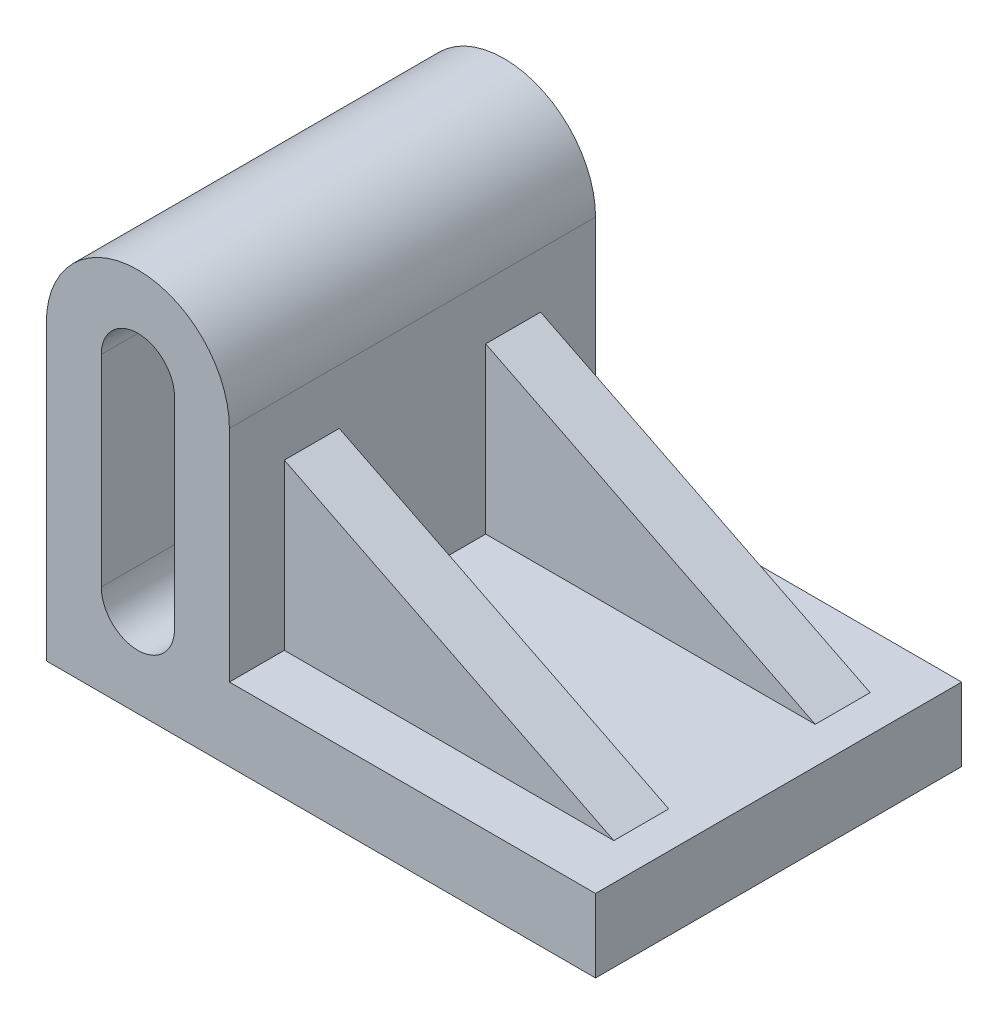
ISO-10303-21;
HEADER;
FILE_DESCRIPTION(('STEP AP214'),'2;1');
FILE_NAME('part.step','',(''),(''),'','','');
FILE_SCHEMA(('AUTOMOTIVE_DESIGN { 1 0 10303 214 1 1 1 1 }'));
ENDSEC;
DATA;
#1=APPLICATION_CONTEXT('core data for automotive mechanical design processes');
#2=APPLICATION_PROTOCOL_DEFINITION('international standard','automotive_design',2000,#1);
#3=PRODUCT_CONTEXT('',#1,'mechanical');
#4=PRODUCT('Part','Part','',(#3));
#5=PRODUCT_RELATED_PRODUCT_CATEGORY('part','',(#4));
#6=PRODUCT_DEFINITION_FORMATION('','',#4);
#7=PRODUCT_DEFINITION_CONTEXT('part definition',#1,'design');
#8=PRODUCT_DEFINITION('design','',#6,#7);
#9=PRODUCT_DEFINITION_SHAPE('','',#8);
#10=(LENGTH_UNIT() NAMED_UNIT(*) SI_UNIT(.MILLI.,.METRE.));
#11=(NAMED_UNIT(*) PLANE_ANGLE_UNIT() SI_UNIT($,.RADIAN.));
#12=(NAMED_UNIT(*) SI_UNIT($,.STERADIAN.) SOLID_ANGLE_UNIT());
#13=UNCERTAINTY_MEASURE_WITH_UNIT(LENGTH_MEASURE(1.E-05),#10,'distance_accuracy_value','');
#14=(GEOMETRIC_REPRESENTATION_CONTEXT(3) GLOBAL_UNCERTAINTY_ASSIGNED_CONTEXT((#13)) GLOBAL_UNIT_ASSIGNED_CONTEXT((#10,
#11,#12)) REPRESENTATION_CONTEXT('',''));
#15=CARTESIAN_POINT('',(0.,0.,0.));
#16=DIRECTION('',(0.,0.,1.));
#17=DIRECTION('',(1.,0.,0.));
#18=AXIS2_PLACEMENT_3D('',#15,#16,#17);
#19=CARTESIAN_POINT('',(140.,20.,-35.));
#20=DIRECTION('',(0.447213595499958,0.894427190999916,0.));
#21=DIRECTION('',(-0.894427190999916,0.447213595499958,0.));
#22=AXIS2_PLACEMENT_3D('',#19,#20,#21);
#23=PLANE('',#22);
#24=DIRECTION('',(0.,0.,1.));
#25=VECTOR('',#24,1.);
#26=CARTESIAN_POINT('',(50.,65.,-35.));
#27=LINE('',#26,#25);
#28=CARTESIAN_POINT('',(50.,65.,-35.));
#29=VERTEX_POINT('',#28);
#30=CARTESIAN_POINT('',(50.,65.,-20.));
#31=VERTEX_POINT('',#30);
#32=EDGE_CURVE('E71',#29,#31,#27,.T.);
#33=ORIENTED_EDGE('',*,*,#32,.T.);
#34=DIRECTION('',(-0.894427190999916,0.447213595499958,0.));
#35=VECTOR('',#34,1.);
#36=CARTESIAN_POINT('',(140.,20.,-20.));
#37=LINE('',#36,#35);
#38=CARTESIAN_POINT('',(140.,20.,-20.));
#39=VERTEX_POINT('',#38);
#40=EDGE_CURVE('E164',#39,#31,#37,.T.);
#41=ORIENTED_EDGE('',*,*,#40,.F.);
#42=DIRECTION('',(0.,0.,1.));
#43=VECTOR('',#42,1.);
#44=CARTESIAN_POINT('',(140.,20.,-35.));
#45=LINE('',#44,#43);
#46=CARTESIAN_POINT('',(140.,20.,-35.));
#47=VERTEX_POINT('',#46);
#48=EDGE_CURVE('E181',#47,#39,#45,.T.);
#49=ORIENTED_EDGE('',*,*,#48,.F.);
#50=DIRECTION('',(-0.894427190999916,0.447213595499958,0.));
#51=VECTOR('',#50,1.);
#52=CARTESIAN_POINT('',(140.,20.,-35.));
#53=LINE('',#52,#51);
#54=EDGE_CURVE('E174',#47,#29,#53,.T.);
#55=ORIENTED_EDGE('',*,*,#54,.T.);
#56=EDGE_LOOP('',(#33,#41,#49,#55));
#57=FACE_BOUND('',#56,.T.);
#58=ADVANCED_FACE('F45',(#57),#23,.T.);
#59=CARTESIAN_POINT('',(50.,20.,-50.));
#60=DIRECTION('',(1.,0.,0.));
#61=DIRECTION('',(0.,0.,-1.));
#62=AXIS2_PLACEMENT_3D('',#59,#60,#61);
#63=PLANE('',#62);
#64=ORIENTED_EDGE('',*,*,#32,.F.);
#65=DIRECTION('',(0.,-1.,0.));
#66=VECTOR('',#65,1.);
#67=CARTESIAN_POINT('',(50.,65.,-35.));
#68=LINE('',#67,#66);
#69=CARTESIAN_POINT('',(50.,20.,-35.));
#70=VERTEX_POINT('',#69);
#71=EDGE_CURVE('E338',#29,#70,#68,.T.);
#72=ORIENTED_EDGE('',*,*,#71,.T.);
#73=DIRECTION('',(0.,0.,1.));
#74=VECTOR('',#73,1.);
#75=CARTESIAN_POINT('',(50.,20.,-50.));
#76=LINE('',#75,#74);
#77=CARTESIAN_POINT('',(50.,20.,-50.));
#78=VERTEX_POINT('',#77);
#79=EDGE_CURVE('E280',#78,#70,#76,.T.);
#80=ORIENTED_EDGE('',*,*,#79,.F.);
#81=DIRECTION('',(0.,1.,0.));
#82=VECTOR('',#81,1.);
#83=CARTESIAN_POINT('',(50.,20.,-50.));
#84=LINE('',#83,#82);
#85=CARTESIAN_POINT('',(50.,80.,-50.));
#86=VERTEX_POINT('',#85);
#87=EDGE_CURVE('E270',#78,#86,#84,.T.);
#88=ORIENTED_EDGE('',*,*,#87,.T.);
#89=DIRECTION('',(0.,0.,1.));
#90=VECTOR('',#89,1.);
#91=CARTESIAN_POINT('',(50.,80.,-50.));
#92=LINE('',#91,#90);
#93=CARTESIAN_POINT('',(50.,80.,50.));
#94=VERTEX_POINT('',#93);
#95=EDGE_CURVE('E55',#86,#94,#92,.T.);
#96=ORIENTED_EDGE('',*,*,#95,.T.);
#97=DIRECTION('',(0.,1.,0.));
#98=VECTOR('',#97,1.);
#99=CARTESIAN_POINT('',(50.,20.,50.));
#100=LINE('',#99,#98);
#101=CARTESIAN_POINT('',(50.,20.,50.));
#102=VERTEX_POINT('',#101);
#103=EDGE_CURVE('E246',#102,#94,#100,.T.);
#104=ORIENTED_EDGE('',*,*,#103,.F.);
#105=CARTESIAN_POINT('',(50.,20.,35.));
#106=VERTEX_POINT('',#105);
#107=EDGE_CURVE('E284',#106,#102,#76,.T.);
#108=ORIENTED_EDGE('',*,*,#107,.F.);
#109=DIRECTION('',(0.,-1.,0.));
#110=VECTOR('',#109,1.);
#111=CARTESIAN_POINT('',(50.,65.,35.));
#112=LINE('',#111,#110);
#113=CARTESIAN_POINT('',(50.,65.,35.));
#114=VERTEX_POINT('',#113);
#115=EDGE_CURVE('E322',#114,#106,#112,.T.);
#116=ORIENTED_EDGE('',*,*,#115,.F.);
#117=CARTESIAN_POINT('',(50.,65.,20.));
#118=VERTEX_POINT('',#117);
#119=EDGE_CURVE('E177',#118,#114,#27,.T.);
#120=ORIENTED_EDGE('',*,*,#119,.F.);
#121=DIRECTION('',(0.,-1.,0.));
#122=VECTOR('',#121,1.);
#123=CARTESIAN_POINT('',(50.,65.,20.));
#124=LINE('',#123,#122);
#125=CARTESIAN_POINT('',(50.,20.,20.));
#126=VERTEX_POINT('',#125);
#127=EDGE_CURVE('E489',#118,#126,#124,.T.);
#128=ORIENTED_EDGE('',*,*,#127,.T.);
#129=DIRECTION('',(0.,0.,-1.));
#130=VECTOR('',#129,1.);
#131=CARTESIAN_POINT('',(50.,20.,20.));
#132=LINE('',#131,#130);
#133=CARTESIAN_POINT('',(50.,20.,-20.));
#134=VERTEX_POINT('',#133);
#135=EDGE_CURVE('E162',#126,#134,#132,.T.);
#136=ORIENTED_EDGE('',*,*,#135,.T.);
#137=DIRECTION('',(0.,-1.,0.));
#138=VECTOR('',#137,1.);
#139=CARTESIAN_POINT('',(50.,65.,-20.));
#140=LINE('',#139,#138);
#141=EDGE_CURVE('E159',#31,#134,#140,.T.);
#142=ORIENTED_EDGE('',*,*,#141,.F.);
#143=EDGE_LOOP('',(#64,#72,#80,#88,#96,#104,#108,#116,#120,#128,#136,#142));
#144=FACE_BOUND('',#143,.T.);
#145=ADVANCED_FACE('F160',(#144),#63,.T.);
#146=CARTESIAN_POINT('',(150.,20.,-50.));
#147=DIRECTION('',(0.,1.,0.));
#148=DIRECTION('',(-1.,0.,0.));
#149=AXIS2_PLACEMENT_3D('',#146,#147,#148);
#150=PLANE('',#149);
#151=ORIENTED_EDGE('',*,*,#79,.T.);
#152=DIRECTION('',(1.,0.,0.));
#153=VECTOR('',#152,1.);
#154=CARTESIAN_POINT('',(50.,20.,-35.));
#155=LINE('',#154,#153);
#156=EDGE_CURVE('E183',#70,#47,#155,.T.);
#157=ORIENTED_EDGE('',*,*,#156,.T.);
#158=ORIENTED_EDGE('',*,*,#48,.T.);
#159=DIRECTION('',(1.,0.,0.));
#160=VECTOR('',#159,1.);
#161=CARTESIAN_POINT('',(50.,20.,-20.));
#162=LINE('',#161,#160);
#163=EDGE_CURVE('E63',#134,#39,#162,.T.);
#164=ORIENTED_EDGE('',*,*,#163,.F.);
#165=ORIENTED_EDGE('',*,*,#135,.F.);
#166=DIRECTION('',(1.,0.,0.));
#167=VECTOR('',#166,1.);
#168=CARTESIAN_POINT('',(50.,20.,20.));
#169=LINE('',#168,#167);
#170=CARTESIAN_POINT('',(140.,20.,20.));
#171=VERTEX_POINT('',#170);
#172=EDGE_CURVE('E488',#126,#171,#169,.T.);
#173=ORIENTED_EDGE('',*,*,#172,.T.);
#174=CARTESIAN_POINT('',(140.,20.,35.));
#175=VERTEX_POINT('',#174);
#176=EDGE_CURVE('E176',#171,#175,#45,.T.);
#177=ORIENTED_EDGE('',*,*,#176,.T.);
#178=DIRECTION('',(1.,0.,0.));
#179=VECTOR('',#178,1.);
#180=CARTESIAN_POINT('',(50.,20.,35.));
#181=LINE('',#180,#179);
#182=EDGE_CURVE('E317',#106,#175,#181,.T.);
#183=ORIENTED_EDGE('',*,*,#182,.F.);
#184=ORIENTED_EDGE('',*,*,#107,.T.);
#185=DIRECTION('',(-1.,0.,0.));
#186=VECTOR('',#185,1.);
#187=CARTESIAN_POINT('',(150.,20.,50.));
#188=LINE('',#187,#186);
#189=CARTESIAN_POINT('',(150.,20.,50.));
#190=VERTEX_POINT('',#189);
#191=EDGE_CURVE('E242',#190,#102,#188,.T.);
#192=ORIENTED_EDGE('',*,*,#191,.F.);
#193=DIRECTION('',(0.,0.,1.));
#194=VECTOR('',#193,1.);
#195=CARTESIAN_POINT('',(150.,20.,-50.));
#196=LINE('',#195,#194);
#197=CARTESIAN_POINT('',(150.,20.,-50.));
#198=VERTEX_POINT('',#197);
#199=EDGE_CURVE('E285',#198,#190,#196,.T.);
#200=ORIENTED_EDGE('',*,*,#199,.F.);
#201=DIRECTION('',(-1.,0.,0.));
#202=VECTOR('',#201,1.);
#203=CARTESIAN_POINT('',(150.,20.,-50.));
#204=LINE('',#203,#202);
#205=EDGE_CURVE('E266',#198,#78,#204,.T.);
#206=ORIENTED_EDGE('',*,*,#205,.T.);
#207=EDGE_LOOP('',(#151,#157,#158,#164,#165,#173,#177,#183,#184,#192,#200,#206));
#208=FACE_BOUND('',#207,.T.);
#209=ADVANCED_FACE('F314',(#208),#150,.T.);
#210=CARTESIAN_POINT('',(0.,80.,-50.));
#211=DIRECTION('',(-1.,0.,0.));
#212=DIRECTION('',(0.,-1.,0.));
#213=AXIS2_PLACEMENT_3D('',#210,#211,#212);
#214=PLANE('',#213);
#215=DIRECTION('',(0.,0.,1.));
#216=VECTOR('',#215,1.);
#217=CARTESIAN_POINT('',(0.,0.,-50.));
#218=LINE('',#217,#216);
#219=CARTESIAN_POINT('',(0.,0.,-50.));
#220=VERTEX_POINT('',#219);
#221=CARTESIAN_POINT('',(0.,0.,50.));
#222=VERTEX_POINT('',#221);
#223=EDGE_CURVE('E49',#220,#222,#218,.T.);
#224=ORIENTED_EDGE('',*,*,#223,.T.);
#225=DIRECTION('',(0.,-1.,0.));
#226=VECTOR('',#225,1.);
#227=CARTESIAN_POINT('',(0.,80.,50.));
#228=LINE('',#227,#226);
#229=CARTESIAN_POINT('',(0.,80.,50.));
#230=VERTEX_POINT('',#229);
#231=EDGE_CURVE('E221',#230,#222,#228,.T.);
#232=ORIENTED_EDGE('',*,*,#231,.F.);
#233=DIRECTION('',(0.,0.,1.));
#234=VECTOR('',#233,1.);
#235=CARTESIAN_POINT('',(0.,80.,-50.));
#236=LINE('',#235,#234);
#237=CARTESIAN_POINT('',(0.,80.,-50.));
#238=VERTEX_POINT('',#237);
#239=EDGE_CURVE('E11',#238,#230,#236,.T.);
#240=ORIENTED_EDGE('',*,*,#239,.F.);
#241=DIRECTION('',(0.,-1.,0.));
#242=VECTOR('',#241,1.);
#243=CARTESIAN_POINT('',(0.,80.,-50.));
#244=LINE('',#243,#242);
#245=EDGE_CURVE('E254',#238,#220,#244,.T.);
#246=ORIENTED_EDGE('',*,*,#245,.T.);
#247=EDGE_LOOP('',(#224,#232,#240,#246));
#248=FACE_BOUND('',#247,.T.);
#249=ADVANCED_FACE('F47',(#248),#214,.T.);
#250=CARTESIAN_POINT('',(25.,80.,-50.));
#251=DIRECTION('',(0.,0.,1.));
#252=DIRECTION('',(1.,0.,0.));
#253=AXIS2_PLACEMENT_3D('',#250,#251,#252);
#254=CYLINDRICAL_SURFACE('',#253,25.);
#255=ORIENTED_EDGE('',*,*,#239,.T.);
#256=CARTESIAN_POINT('',(25.,80.,50.));
#257=DIRECTION('',(0.,0.,1.));
#258=DIRECTION('',(1.,0.,0.));
#259=AXIS2_PLACEMENT_3D('',#256,#257,#258);
#260=CIRCLE('',#259,25.);
#261=EDGE_CURVE('E250',#94,#230,#260,.T.);
#262=ORIENTED_EDGE('',*,*,#261,.F.);
#263=ORIENTED_EDGE('',*,*,#95,.F.);
#264=CARTESIAN_POINT('',(25.,80.,-50.));
#265=DIRECTION('',(0.,0.,1.));
#266=DIRECTION('',(1.,0.,0.));
#267=AXIS2_PLACEMENT_3D('',#264,#265,#266);
#268=CIRCLE('',#267,25.);
#269=EDGE_CURVE('E274',#86,#238,#268,.T.);
#270=ORIENTED_EDGE('',*,*,#269,.T.);
#271=EDGE_LOOP('',(#255,#262,#263,#270));
#272=FACE_BOUND('',#271,.T.);
#273=ADVANCED_FACE('F303',(#272),#254,.T.);
#274=CARTESIAN_POINT('',(150.,0.,-50.));
#275=DIRECTION('',(1.,0.,0.));
#276=DIRECTION('',(0.,0.,-1.));
#277=AXIS2_PLACEMENT_3D('',#274,#275,#276);
#278=PLANE('',#277);
#279=ORIENTED_EDGE('',*,*,#199,.T.);
#280=DIRECTION('',(0.,1.,0.));
#281=VECTOR('',#280,1.);
#282=CARTESIAN_POINT('',(150.,0.,50.));
#283=LINE('',#282,#281);
#284=CARTESIAN_POINT('',(150.,0.,50.));
#285=VERTEX_POINT('',#284);
#286=EDGE_CURVE('E238',#285,#190,#283,.T.);
#287=ORIENTED_EDGE('',*,*,#286,.F.);
#288=DIRECTION('',(0.,0.,1.));
#289=VECTOR('',#288,1.);
#290=CARTESIAN_POINT('',(150.,0.,-50.));
#291=LINE('',#290,#289);
#292=CARTESIAN_POINT('',(150.,0.,-50.));
#293=VERTEX_POINT('',#292);
#294=EDGE_CURVE('E287',#293,#285,#291,.T.);
#295=ORIENTED_EDGE('',*,*,#294,.F.);
#296=DIRECTION('',(0.,1.,0.));
#297=VECTOR('',#296,1.);
#298=CARTESIAN_POINT('',(150.,0.,-50.));
#299=LINE('',#298,#297);
#300=EDGE_CURVE('E262',#293,#198,#299,.T.);
#301=ORIENTED_EDGE('',*,*,#300,.T.);
#302=EDGE_LOOP('',(#279,#287,#295,#301));
#303=FACE_BOUND('',#302,.T.);
#304=ADVANCED_FACE('F311',(#303),#278,.T.);
#305=CARTESIAN_POINT('',(0.,0.,-50.));
#306=DIRECTION('',(0.,-1.,0.));
#307=DIRECTION('',(0.,0.,-1.));
#308=AXIS2_PLACEMENT_3D('',#305,#306,#307);
#309=PLANE('',#308);
#310=ORIENTED_EDGE('',*,*,#294,.T.);
#311=DIRECTION('',(1.,0.,0.));
#312=VECTOR('',#311,1.);
#313=CARTESIAN_POINT('',(0.,0.,50.));
#314=LINE('',#313,#312);
#315=EDGE_CURVE('E234',#222,#285,#314,.T.);
#316=ORIENTED_EDGE('',*,*,#315,.F.);
#317=ORIENTED_EDGE('',*,*,#223,.F.);
#318=DIRECTION('',(1.,0.,0.));
#319=VECTOR('',#318,1.);
#320=CARTESIAN_POINT('',(0.,0.,-50.));
#321=LINE('',#320,#319);
#322=EDGE_CURVE('E258',#220,#293,#321,.T.);
#323=ORIENTED_EDGE('',*,*,#322,.T.);
#324=EDGE_LOOP('',(#310,#316,#317,#323));
#325=FACE_BOUND('',#324,.T.);
#326=ADVANCED_FACE('F296',(#325),#309,.T.);
#327=CARTESIAN_POINT('',(25.,80.,-50.));
#328=DIRECTION('',(0.,0.,1.));
#329=DIRECTION('',(1.,0.,0.));
#330=AXIS2_PLACEMENT_3D('',#327,#328,#329);
#331=PLANE('',#330);
#332=DIRECTION('',(0.,1.,0.));
#333=VECTOR('',#332,1.);
#334=CARTESIAN_POINT('',(35.,80.,-50.));
#335=LINE('',#334,#333);
#336=CARTESIAN_POINT('',(35.,25.,-50.));
#337=VERTEX_POINT('',#336);
#338=CARTESIAN_POINT('',(35.,80.,-50.));
#339=VERTEX_POINT('',#338);
#340=EDGE_CURVE('E213',#337,#339,#335,.T.);
#341=ORIENTED_EDGE('',*,*,#340,.T.);
#342=CARTESIAN_POINT('',(25.,80.,-50.));
#343=DIRECTION('',(0.,0.,1.));
#344=DIRECTION('',(1.,0.,0.));
#345=AXIS2_PLACEMENT_3D('',#342,#343,#344);
#346=CIRCLE('',#345,10.);
#347=CARTESIAN_POINT('',(15.,80.,-50.));
#348=VERTEX_POINT('',#347);
#349=EDGE_CURVE('E201',#339,#348,#346,.T.);
#350=ORIENTED_EDGE('',*,*,#349,.T.);
#351=DIRECTION('',(0.,-1.,0.));
#352=VECTOR('',#351,1.);
#353=CARTESIAN_POINT('',(15.,80.,-50.));
#354=LINE('',#353,#352);
#355=CARTESIAN_POINT('',(15.,25.,-50.));
#356=VERTEX_POINT('',#355);
#357=EDGE_CURVE('E205',#348,#356,#354,.T.);
#358=ORIENTED_EDGE('',*,*,#357,.T.);
#359=CARTESIAN_POINT('',(25.,25.,-50.));
#360=DIRECTION('',(0.,0.,1.));
#361=DIRECTION('',(1.,0.,0.));
#362=AXIS2_PLACEMENT_3D('',#359,#360,#361);
#363=CIRCLE('',#362,10.);
#364=EDGE_CURVE('E209',#356,#337,#363,.T.);
#365=ORIENTED_EDGE('',*,*,#364,.T.);
#366=EDGE_LOOP('',(#341,#350,#358,#365));
#367=FACE_BOUND('',#366,.T.);
#368=ORIENTED_EDGE('',*,*,#245,.F.);
#369=ORIENTED_EDGE('',*,*,#269,.F.);
#370=ORIENTED_EDGE('',*,*,#87,.F.);
#371=ORIENTED_EDGE('',*,*,#205,.F.);
#372=ORIENTED_EDGE('',*,*,#300,.F.);
#373=ORIENTED_EDGE('',*,*,#322,.F.);
#374=EDGE_LOOP('',(#368,#369,#370,#371,#372,#373));
#375=FACE_BOUND('',#374,.T.);
#376=ADVANCED_FACE('F306',(#367,#375),#331,.F.);
#377=CARTESIAN_POINT('',(25.,80.,50.));
#378=DIRECTION('',(0.,0.,1.));
#379=DIRECTION('',(1.,0.,0.));
#380=AXIS2_PLACEMENT_3D('',#377,#378,#379);
#381=PLANE('',#380);
#382=CARTESIAN_POINT('',(25.,80.,50.));
#383=DIRECTION('',(0.,0.,1.));
#384=DIRECTION('',(1.,0.,0.));
#385=AXIS2_PLACEMENT_3D('',#382,#383,#384);
#386=CIRCLE('',#385,10.);
#387=CARTESIAN_POINT('',(35.,80.,50.));
#388=VERTEX_POINT('',#387);
#389=CARTESIAN_POINT('',(15.,80.,50.));
#390=VERTEX_POINT('',#389);
#391=EDGE_CURVE('E186',#388,#390,#386,.T.);
#392=ORIENTED_EDGE('',*,*,#391,.F.);
#393=DIRECTION('',(0.,1.,0.));
#394=VECTOR('',#393,1.);
#395=CARTESIAN_POINT('',(35.,80.,50.));
#396=LINE('',#395,#394);
#397=CARTESIAN_POINT('',(35.,25.,50.));
#398=VERTEX_POINT('',#397);
#399=EDGE_CURVE('E197',#398,#388,#396,.T.);
#400=ORIENTED_EDGE('',*,*,#399,.F.);
#401=CARTESIAN_POINT('',(25.,25.,50.));
#402=DIRECTION('',(0.,0.,1.));
#403=DIRECTION('',(1.,0.,0.));
#404=AXIS2_PLACEMENT_3D('',#401,#402,#403);
#405=CIRCLE('',#404,10.);
#406=CARTESIAN_POINT('',(15.,25.,50.));
#407=VERTEX_POINT('',#406);
#408=EDGE_CURVE('E193',#407,#398,#405,.T.);
#409=ORIENTED_EDGE('',*,*,#408,.F.);
#410=DIRECTION('',(0.,-1.,0.));
#411=VECTOR('',#410,1.);
#412=CARTESIAN_POINT('',(15.,80.,50.));
#413=LINE('',#412,#411);
#414=EDGE_CURVE('E189',#390,#407,#413,.T.);
#415=ORIENTED_EDGE('',*,*,#414,.F.);
#416=EDGE_LOOP('',(#392,#400,#409,#415));
#417=FACE_BOUND('',#416,.T.);
#418=ORIENTED_EDGE('',*,*,#231,.T.);
#419=ORIENTED_EDGE('',*,*,#315,.T.);
#420=ORIENTED_EDGE('',*,*,#286,.T.);
#421=ORIENTED_EDGE('',*,*,#191,.T.);
#422=ORIENTED_EDGE('',*,*,#103,.T.);
#423=ORIENTED_EDGE('',*,*,#261,.T.);
#424=EDGE_LOOP('',(#418,#419,#420,#421,#422,#423));
#425=FACE_BOUND('',#424,.T.);
#426=ADVANCED_FACE('F299',(#417,#425),#381,.T.);
#427=CARTESIAN_POINT('',(25.,80.,-50.));
#428=DIRECTION('',(0.,0.,1.));
#429=DIRECTION('',(1.,0.,0.));
#430=AXIS2_PLACEMENT_3D('',#427,#428,#429);
#431=CYLINDRICAL_SURFACE('',#430,10.);
#432=DIRECTION('',(0.,0.,1.));
#433=VECTOR('',#432,1.);
#434=CARTESIAN_POINT('',(15.,80.,-50.));
#435=LINE('',#434,#433);
#436=EDGE_CURVE('E217',#348,#390,#435,.T.);
#437=ORIENTED_EDGE('',*,*,#436,.F.);
#438=ORIENTED_EDGE('',*,*,#349,.F.);
#439=DIRECTION('',(0.,0.,1.));
#440=VECTOR('',#439,1.);
#441=CARTESIAN_POINT('',(35.,80.,-50.));
#442=LINE('',#441,#440);
#443=EDGE_CURVE('E218',#339,#388,#442,.T.);
#444=ORIENTED_EDGE('',*,*,#443,.T.);
#445=ORIENTED_EDGE('',*,*,#391,.T.);
#446=EDGE_LOOP('',(#437,#438,#444,#445));
#447=FACE_BOUND('',#446,.T.);
#448=ADVANCED_FACE('F368',(#447),#431,.F.);
#449=CARTESIAN_POINT('',(35.,80.,-50.));
#450=DIRECTION('',(1.,0.,0.));
#451=DIRECTION('',(0.,1.,0.));
#452=AXIS2_PLACEMENT_3D('',#449,#450,#451);
#453=PLANE('',#452);
#454=ORIENTED_EDGE('',*,*,#443,.F.);
#455=ORIENTED_EDGE('',*,*,#340,.F.);
#456=DIRECTION('',(0.,0.,1.));
#457=VECTOR('',#456,1.);
#458=CARTESIAN_POINT('',(35.,25.,-50.));
#459=LINE('',#458,#457);
#460=EDGE_CURVE('E222',#337,#398,#459,.T.);
#461=ORIENTED_EDGE('',*,*,#460,.T.);
#462=ORIENTED_EDGE('',*,*,#399,.T.);
#463=EDGE_LOOP('',(#454,#455,#461,#462));
#464=FACE_BOUND('',#463,.T.);
#465=ADVANCED_FACE('F364',(#464),#453,.F.);
#466=CARTESIAN_POINT('',(25.,25.,-50.));
#467=DIRECTION('',(0.,0.,1.));
#468=DIRECTION('',(1.,0.,0.));
#469=AXIS2_PLACEMENT_3D('',#466,#467,#468);
#470=CYLINDRICAL_SURFACE('',#469,10.);
#471=ORIENTED_EDGE('',*,*,#460,.F.);
#472=ORIENTED_EDGE('',*,*,#364,.F.);
#473=DIRECTION('',(0.,0.,1.));
#474=VECTOR('',#473,1.);
#475=CARTESIAN_POINT('',(15.,25.,-50.));
#476=LINE('',#475,#474);
#477=EDGE_CURVE('E225',#356,#407,#476,.T.);
#478=ORIENTED_EDGE('',*,*,#477,.T.);
#479=ORIENTED_EDGE('',*,*,#408,.T.);
#480=EDGE_LOOP('',(#471,#472,#478,#479));
#481=FACE_BOUND('',#480,.T.);
#482=ADVANCED_FACE('F367',(#481),#470,.F.);
#483=CARTESIAN_POINT('',(15.,80.,-50.));
#484=DIRECTION('',(-1.,0.,0.));
#485=DIRECTION('',(0.,0.,1.));
#486=AXIS2_PLACEMENT_3D('',#483,#484,#485);
#487=PLANE('',#486);
#488=ORIENTED_EDGE('',*,*,#477,.F.);
#489=ORIENTED_EDGE('',*,*,#357,.F.);
#490=ORIENTED_EDGE('',*,*,#436,.T.);
#491=ORIENTED_EDGE('',*,*,#414,.T.);
#492=EDGE_LOOP('',(#488,#489,#490,#491));
#493=FACE_BOUND('',#492,.T.);
#494=ADVANCED_FACE('F355',(#493),#487,.F.);
#495=DIRECTION('',(-0.894427190999916,0.447213595499958,0.));
#496=VECTOR('',#495,1.);
#497=CARTESIAN_POINT('',(140.,20.,20.));
#498=LINE('',#497,#496);
#499=EDGE_CURVE('E486',#171,#118,#498,.T.);
#500=ORIENTED_EDGE('',*,*,#499,.T.);
#501=ORIENTED_EDGE('',*,*,#119,.T.);
#502=DIRECTION('',(-0.894427190999916,0.447213595499958,0.));
#503=VECTOR('',#502,1.);
#504=CARTESIAN_POINT('',(140.,20.,35.));
#505=LINE('',#504,#503);
#506=EDGE_CURVE('E327',#175,#114,#505,.T.);
#507=ORIENTED_EDGE('',*,*,#506,.F.);
#508=ORIENTED_EDGE('',*,*,#176,.F.);
#509=EDGE_LOOP('',(#500,#501,#507,#508));
#510=FACE_BOUND('',#509,.T.);
#511=ADVANCED_FACE('F346',(#510),#23,.T.);
#512=CARTESIAN_POINT('',(0.,0.,-35.));
#513=DIRECTION('',(0.,0.,1.));
#514=DIRECTION('',(1.,0.,0.));
#515=AXIS2_PLACEMENT_3D('',#512,#513,#514);
#516=PLANE('',#515);
#517=ORIENTED_EDGE('',*,*,#54,.F.);
#518=ORIENTED_EDGE('',*,*,#156,.F.);
#519=ORIENTED_EDGE('',*,*,#71,.F.);
#520=EDGE_LOOP('',(#517,#518,#519));
#521=FACE_BOUND('',#520,.T.);
#522=ADVANCED_FACE('F344',(#521),#516,.F.);
#523=CARTESIAN_POINT('',(0.,0.,35.));
#524=DIRECTION('',(0.,0.,1.));
#525=DIRECTION('',(1.,0.,0.));
#526=AXIS2_PLACEMENT_3D('',#523,#524,#525);
#527=PLANE('',#526);
#528=ORIENTED_EDGE('',*,*,#506,.T.);
#529=ORIENTED_EDGE('',*,*,#115,.T.);
#530=ORIENTED_EDGE('',*,*,#182,.T.);
#531=EDGE_LOOP('',(#528,#529,#530));
#532=FACE_BOUND('',#531,.T.);
#533=ADVANCED_FACE('F325',(#532),#527,.T.);
#534=CARTESIAN_POINT('',(0.,0.,20.));
#535=DIRECTION('',(0.,0.,1.));
#536=DIRECTION('',(1.,0.,0.));
#537=AXIS2_PLACEMENT_3D('',#534,#535,#536);
#538=PLANE('',#537);
#539=ORIENTED_EDGE('',*,*,#499,.F.);
#540=ORIENTED_EDGE('',*,*,#172,.F.);
#541=ORIENTED_EDGE('',*,*,#127,.F.);
#542=EDGE_LOOP('',(#539,#540,#541));
#543=FACE_BOUND('',#542,.T.);
#544=ADVANCED_FACE('F352',(#543),#538,.F.);
#545=CARTESIAN_POINT('',(0.,0.,-20.));
#546=DIRECTION('',(0.,0.,1.));
#547=DIRECTION('',(1.,0.,0.));
#548=AXIS2_PLACEMENT_3D('',#545,#546,#547);
#549=PLANE('',#548);
#550=ORIENTED_EDGE('',*,*,#40,.T.);
#551=ORIENTED_EDGE('',*,*,#141,.T.);
#552=ORIENTED_EDGE('',*,*,#163,.T.);
#553=EDGE_LOOP('',(#550,#551,#552));
#554=FACE_BOUND('',#553,.T.);
#555=ADVANCED_FACE('F166',(#554),#549,.T.);
#556=CLOSED_SHELL('',(#58,#145,#209,#249,#273,#304,#326,#376,#426,#448,#465,#482,#494,#511,#522,
#533,#544,#555));
#557=MANIFOLD_SOLID_BREP('B2',#556);
#558=ADVANCED_BREP_SHAPE_REPRESENTATION('',(#18,#557),#14);
#559=SHAPE_DEFINITION_REPRESENTATION(#9,#558);
ENDSEC;
END-ISO-10303-21;
